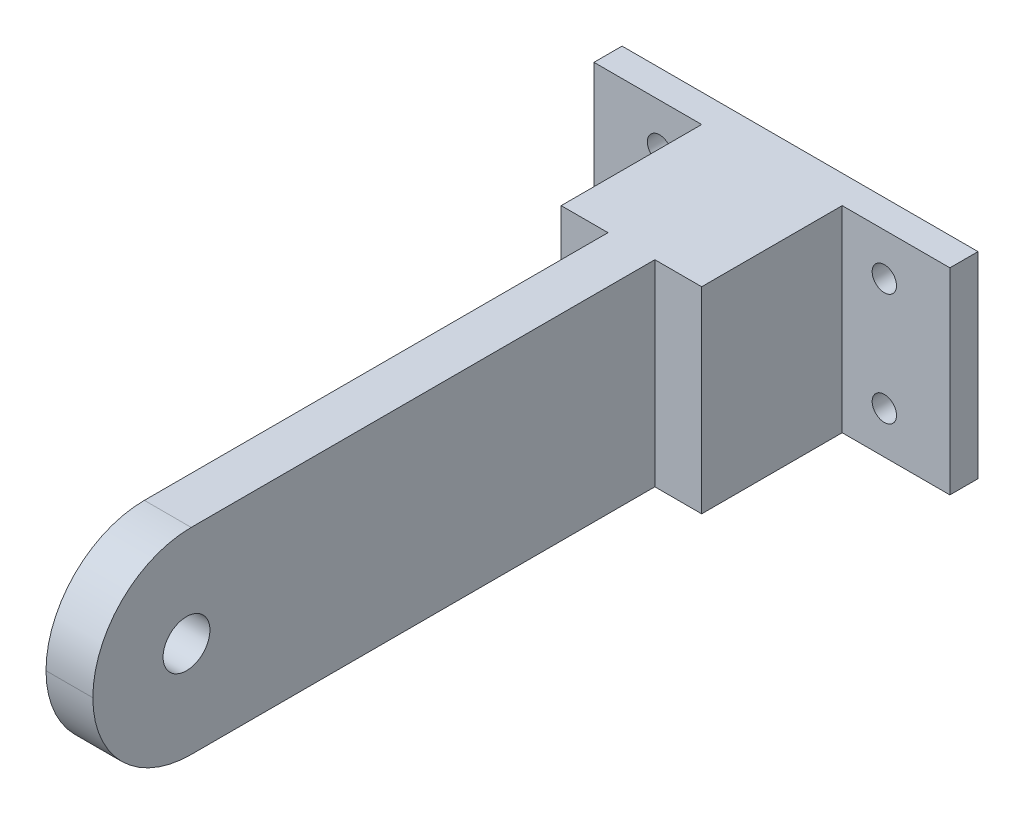
ISO-10303-21;
HEADER;
FILE_DESCRIPTION(('STEP AP214'),'2;1');
FILE_NAME('part.step','',(''),(''),'','','');
FILE_SCHEMA(('AUTOMOTIVE_DESIGN { 1 0 10303 214 1 1 1 1 }'));
ENDSEC;
DATA;
#1=APPLICATION_CONTEXT('core data for automotive mechanical design processes');
#2=APPLICATION_PROTOCOL_DEFINITION('international standard','automotive_design',2000,#1);
#3=PRODUCT_CONTEXT('',#1,'mechanical');
#4=PRODUCT('Part','Part','',(#3));
#5=PRODUCT_RELATED_PRODUCT_CATEGORY('part','',(#4));
#6=PRODUCT_DEFINITION_FORMATION('','',#4);
#7=PRODUCT_DEFINITION_CONTEXT('part definition',#1,'design');
#8=PRODUCT_DEFINITION('design','',#6,#7);
#9=PRODUCT_DEFINITION_SHAPE('','',#8);
#10=(LENGTH_UNIT() NAMED_UNIT(*) SI_UNIT(.MILLI.,.METRE.));
#11=(NAMED_UNIT(*) PLANE_ANGLE_UNIT() SI_UNIT($,.RADIAN.));
#12=(NAMED_UNIT(*) SI_UNIT($,.STERADIAN.) SOLID_ANGLE_UNIT());
#13=UNCERTAINTY_MEASURE_WITH_UNIT(LENGTH_MEASURE(1.E-05),#10,'distance_accuracy_value','');
#14=(GEOMETRIC_REPRESENTATION_CONTEXT(3) GLOBAL_UNCERTAINTY_ASSIGNED_CONTEXT((#13)) GLOBAL_UNIT_ASSIGNED_CONTEXT((#10,
#11,#12)) REPRESENTATION_CONTEXT('',''));
#15=CARTESIAN_POINT('',(0.,0.,0.));
#16=DIRECTION('',(0.,0.,1.));
#17=DIRECTION('',(1.,0.,0.));
#18=AXIS2_PLACEMENT_3D('',#15,#16,#17);
#19=CARTESIAN_POINT('',(0.,0.,18.));
#20=DIRECTION('',(0.,0.,1.));
#21=DIRECTION('',(1.,0.,0.));
#22=AXIS2_PLACEMENT_3D('',#19,#20,#21);
#23=PLANE('',#22);
#24=DIRECTION('',(0.,-1.,0.));
#25=VECTOR('',#24,1.);
#26=CARTESIAN_POINT('',(-11.2897435897436,8.09487179487179,18.));
#27=LINE('',#26,#25);
#28=CARTESIAN_POINT('',(-11.2897435897436,8.09487179487179,18.));
#29=VERTEX_POINT('',#28);
#30=CARTESIAN_POINT('',(-11.2897435897436,-12.9051282051282,18.));
#31=VERTEX_POINT('',#30);
#32=EDGE_CURVE('E157',#29,#31,#27,.T.);
#33=ORIENTED_EDGE('',*,*,#32,.F.);
#34=DIRECTION('',(-1.,0.,0.));
#35=VECTOR('',#34,1.);
#36=CARTESIAN_POINT('',(-16.2897435897436,8.09487179487179,18.));
#37=LINE('',#36,#35);
#38=CARTESIAN_POINT('',(-16.2897435897436,8.09487179487179,18.));
#39=VERTEX_POINT('',#38);
#40=EDGE_CURVE('E154',#29,#39,#37,.T.);
#41=ORIENTED_EDGE('',*,*,#40,.T.);
#42=DIRECTION('',(0.,-1.,0.));
#43=VECTOR('',#42,1.);
#44=CARTESIAN_POINT('',(-16.2897435897436,8.09487179487179,18.));
#45=LINE('',#44,#43);
#46=CARTESIAN_POINT('',(-16.2897435897436,-12.9051282051282,18.));
#47=VERTEX_POINT('',#46);
#48=EDGE_CURVE('E169',#39,#47,#45,.T.);
#49=ORIENTED_EDGE('',*,*,#48,.T.);
#50=DIRECTION('',(1.,0.,0.));
#51=VECTOR('',#50,1.);
#52=CARTESIAN_POINT('',(-16.2897435897436,-12.9051282051282,18.));
#53=LINE('',#52,#51);
#54=EDGE_CURVE('E174',#47,#31,#53,.T.);
#55=ORIENTED_EDGE('',*,*,#54,.T.);
#56=EDGE_LOOP('',(#33,#41,#49,#55));
#57=FACE_BOUND('',#56,.T.);
#58=ADVANCED_FACE('F41',(#57),#23,.T.);
#59=CARTESIAN_POINT('',(0.,0.,3.));
#60=DIRECTION('',(0.,0.,1.));
#61=DIRECTION('',(1.,0.,0.));
#62=AXIS2_PLACEMENT_3D('',#59,#60,#61);
#63=PLANE('',#62);
#64=DIRECTION('',(0.,-1.,0.));
#65=VECTOR('',#64,1.);
#66=CARTESIAN_POINT('',(-16.2897435897436,8.09487179487179,3.));
#67=LINE('',#66,#65);
#68=CARTESIAN_POINT('',(-16.2897435897436,8.09487179487179,3.));
#69=VERTEX_POINT('',#68);
#70=CARTESIAN_POINT('',(-16.2897435897436,-12.9051282051282,3.));
#71=VERTEX_POINT('',#70);
#72=EDGE_CURVE('E168',#69,#71,#67,.T.);
#73=ORIENTED_EDGE('',*,*,#72,.F.);
#74=DIRECTION('',(-1.,0.,0.));
#75=VECTOR('',#74,1.);
#76=CARTESIAN_POINT('',(-27.7897435897436,8.09487179487179,3.));
#77=LINE('',#76,#75);
#78=CARTESIAN_POINT('',(-27.7897435897436,8.09487179487179,3.));
#79=VERTEX_POINT('',#78);
#80=EDGE_CURVE('E226',#69,#79,#77,.T.);
#81=ORIENTED_EDGE('',*,*,#80,.T.);
#82=DIRECTION('',(0.,-1.,0.));
#83=VECTOR('',#82,1.);
#84=CARTESIAN_POINT('',(-27.7897435897436,8.09487179487179,3.));
#85=LINE('',#84,#83);
#86=CARTESIAN_POINT('',(-27.7897435897436,-12.9051282051282,3.));
#87=VERTEX_POINT('',#86);
#88=EDGE_CURVE('E217',#79,#87,#85,.T.);
#89=ORIENTED_EDGE('',*,*,#88,.T.);
#90=DIRECTION('',(1.,0.,0.));
#91=VECTOR('',#90,1.);
#92=CARTESIAN_POINT('',(-27.7897435897436,-12.9051282051282,3.));
#93=LINE('',#92,#91);
#94=EDGE_CURVE('E222',#87,#71,#93,.T.);
#95=ORIENTED_EDGE('',*,*,#94,.T.);
#96=EDGE_LOOP('',(#73,#81,#89,#95));
#97=FACE_BOUND('',#96,.T.);
#98=CARTESIAN_POINT('',(-20.7897435897436,-8.40512820512821,3.));
#99=DIRECTION('',(0.,0.,1.));
#100=DIRECTION('',(1.,0.,0.));
#101=AXIS2_PLACEMENT_3D('',#98,#99,#100);
#102=CIRCLE('',#101,1.3);
#103=CARTESIAN_POINT('',(-19.4897435897436,-8.40512820512821,3.));
#104=VERTEX_POINT('',#103);
#105=EDGE_CURVE('E212',#104,#104,#102,.T.);
#106=ORIENTED_EDGE('',*,*,#105,.F.);
#107=EDGE_LOOP('',(#106));
#108=FACE_BOUND('',#107,.T.);
#109=CARTESIAN_POINT('',(-20.7897435897436,3.59487179487179,3.));
#110=DIRECTION('',(0.,0.,1.));
#111=DIRECTION('',(1.,0.,0.));
#112=AXIS2_PLACEMENT_3D('',#109,#110,#111);
#113=CIRCLE('',#112,1.3);
#114=CARTESIAN_POINT('',(-19.4897435897436,3.59487179487179,3.));
#115=VERTEX_POINT('',#114);
#116=EDGE_CURVE('E209',#115,#115,#113,.T.);
#117=ORIENTED_EDGE('',*,*,#116,.F.);
#118=EDGE_LOOP('',(#117));
#119=FACE_BOUND('',#118,.T.);
#120=ADVANCED_FACE('F288',(#97,#108,#119),#63,.T.);
#121=CARTESIAN_POINT('',(-27.7897435897436,8.09487179487179,3.));
#122=DIRECTION('',(1.,0.,0.));
#123=DIRECTION('',(0.,1.,0.));
#124=AXIS2_PLACEMENT_3D('',#121,#122,#123);
#125=PLANE('',#124);
#126=DIRECTION('',(0.,-1.,0.));
#127=VECTOR('',#126,1.);
#128=CARTESIAN_POINT('',(-27.7897435897436,8.09487179487179,0.));
#129=LINE('',#128,#127);
#130=CARTESIAN_POINT('',(-27.7897435897436,8.09487179487179,0.));
#131=VERTEX_POINT('',#130);
#132=CARTESIAN_POINT('',(-27.7897435897436,-12.9051282051282,0.));
#133=VERTEX_POINT('',#132);
#134=EDGE_CURVE('E208',#131,#133,#129,.T.);
#135=ORIENTED_EDGE('',*,*,#134,.T.);
#136=DIRECTION('',(0.,0.,-1.));
#137=VECTOR('',#136,1.);
#138=CARTESIAN_POINT('',(-27.7897435897436,-12.9051282051282,3.));
#139=LINE('',#138,#137);
#140=EDGE_CURVE('E245',#87,#133,#139,.T.);
#141=ORIENTED_EDGE('',*,*,#140,.F.);
#142=ORIENTED_EDGE('',*,*,#88,.F.);
#143=DIRECTION('',(0.,0.,-1.));
#144=VECTOR('',#143,1.);
#145=CARTESIAN_POINT('',(-27.7897435897436,8.09487179487179,3.));
#146=LINE('',#145,#144);
#147=EDGE_CURVE('E229',#79,#131,#146,.T.);
#148=ORIENTED_EDGE('',*,*,#147,.T.);
#149=EDGE_LOOP('',(#135,#141,#142,#148));
#150=FACE_BOUND('',#149,.T.);
#151=ADVANCED_FACE('F295',(#150),#125,.F.);
#152=CARTESIAN_POINT('',(-27.7897435897436,-12.9051282051282,3.));
#153=DIRECTION('',(0.,1.,0.));
#154=DIRECTION('',(0.,0.,1.));
#155=AXIS2_PLACEMENT_3D('',#152,#153,#154);
#156=PLANE('',#155);
#157=DIRECTION('',(0.,0.,-1.));
#158=VECTOR('',#157,1.);
#159=CARTESIAN_POINT('',(-6.28974358974358,-12.9051282051282,78.));
#160=LINE('',#159,#158);
#161=CARTESIAN_POINT('',(-6.28974358974358,-12.9051282051282,67.5));
#162=VERTEX_POINT('',#161);
#163=CARTESIAN_POINT('',(-6.28974358974358,-12.9051282051282,18.));
#164=VERTEX_POINT('',#163);
#165=EDGE_CURVE('E142',#162,#164,#160,.T.);
#166=ORIENTED_EDGE('',*,*,#165,.F.);
#167=DIRECTION('',(1.,0.,0.));
#168=VECTOR('',#167,1.);
#169=CARTESIAN_POINT('',(-11.2897435897436,-12.9051282051282,67.5));
#170=LINE('',#169,#168);
#171=CARTESIAN_POINT('',(-11.2897435897436,-12.9051282051282,67.5));
#172=VERTEX_POINT('',#171);
#173=EDGE_CURVE('E11',#162,#172,#170,.F.);
#174=ORIENTED_EDGE('',*,*,#173,.T.);
#175=DIRECTION('',(0.,0.,-1.));
#176=VECTOR('',#175,1.);
#177=CARTESIAN_POINT('',(-11.2897435897436,-12.9051282051282,78.));
#178=LINE('',#177,#176);
#179=EDGE_CURVE('E166',#172,#31,#178,.T.);
#180=ORIENTED_EDGE('',*,*,#179,.T.);
#181=ORIENTED_EDGE('',*,*,#54,.F.);
#182=DIRECTION('',(0.,0.,-1.));
#183=VECTOR('',#182,1.);
#184=CARTESIAN_POINT('',(-16.2897435897436,-12.9051282051282,18.));
#185=LINE('',#184,#183);
#186=EDGE_CURVE('E189',#47,#71,#185,.T.);
#187=ORIENTED_EDGE('',*,*,#186,.T.);
#188=ORIENTED_EDGE('',*,*,#94,.F.);
#189=ORIENTED_EDGE('',*,*,#140,.T.);
#190=DIRECTION('',(1.,0.,0.));
#191=VECTOR('',#190,1.);
#192=CARTESIAN_POINT('',(-27.7897435897436,-12.9051282051282,0.));
#193=LINE('',#192,#191);
#194=CARTESIAN_POINT('',(10.2102564102564,-12.9051282051282,0.));
#195=VERTEX_POINT('',#194);
#196=EDGE_CURVE('E232',#133,#195,#193,.T.);
#197=ORIENTED_EDGE('',*,*,#196,.T.);
#198=DIRECTION('',(0.,0.,-1.));
#199=VECTOR('',#198,1.);
#200=CARTESIAN_POINT('',(10.2102564102564,-12.9051282051282,3.));
#201=LINE('',#200,#199);
#202=CARTESIAN_POINT('',(10.2102564102564,-12.9051282051282,3.));
#203=VERTEX_POINT('',#202);
#204=EDGE_CURVE('E242',#203,#195,#201,.T.);
#205=ORIENTED_EDGE('',*,*,#204,.F.);
#206=CARTESIAN_POINT('',(-1.28974358974358,-12.9051282051282,3.));
#207=VERTEX_POINT('',#206);
#208=EDGE_CURVE('E220',#207,#203,#93,.T.);
#209=ORIENTED_EDGE('',*,*,#208,.F.);
#210=DIRECTION('',(0.,0.,-1.));
#211=VECTOR('',#210,1.);
#212=CARTESIAN_POINT('',(-1.28974358974358,-12.9051282051282,18.));
#213=LINE('',#212,#211);
#214=CARTESIAN_POINT('',(-1.28974358974358,-12.9051282051282,18.));
#215=VERTEX_POINT('',#214);
#216=EDGE_CURVE('E186',#215,#207,#213,.T.);
#217=ORIENTED_EDGE('',*,*,#216,.F.);
#218=EDGE_CURVE('E172',#164,#215,#53,.T.);
#219=ORIENTED_EDGE('',*,*,#218,.F.);
#220=EDGE_LOOP('',(#166,#174,#180,#181,#187,#188,#189,#197,#205,#209,#217,#219));
#221=FACE_BOUND('',#220,.T.);
#222=ADVANCED_FACE('F340',(#221),#156,.F.);
#223=CARTESIAN_POINT('',(10.2102564102564,8.09487179487179,3.));
#224=DIRECTION('',(-1.,0.,0.));
#225=DIRECTION('',(0.,-1.,0.));
#226=AXIS2_PLACEMENT_3D('',#223,#224,#225);
#227=PLANE('',#226);
#228=DIRECTION('',(0.,1.,0.));
#229=VECTOR('',#228,1.);
#230=CARTESIAN_POINT('',(10.2102564102564,8.09487179487179,0.));
#231=LINE('',#230,#229);
#232=CARTESIAN_POINT('',(10.2102564102564,8.09487179487179,0.));
#233=VERTEX_POINT('',#232);
#234=EDGE_CURVE('E234',#195,#233,#231,.T.);
#235=ORIENTED_EDGE('',*,*,#234,.T.);
#236=DIRECTION('',(0.,0.,-1.));
#237=VECTOR('',#236,1.);
#238=CARTESIAN_POINT('',(10.2102564102564,8.09487179487179,3.));
#239=LINE('',#238,#237);
#240=CARTESIAN_POINT('',(10.2102564102564,8.09487179487179,3.));
#241=VERTEX_POINT('',#240);
#242=EDGE_CURVE('E239',#241,#233,#239,.T.);
#243=ORIENTED_EDGE('',*,*,#242,.F.);
#244=DIRECTION('',(0.,1.,0.));
#245=VECTOR('',#244,1.);
#246=CARTESIAN_POINT('',(10.2102564102564,8.09487179487179,3.));
#247=LINE('',#246,#245);
#248=EDGE_CURVE('E224',#203,#241,#247,.T.);
#249=ORIENTED_EDGE('',*,*,#248,.F.);
#250=ORIENTED_EDGE('',*,*,#204,.T.);
#251=EDGE_LOOP('',(#235,#243,#249,#250));
#252=FACE_BOUND('',#251,.T.);
#253=ADVANCED_FACE('F337',(#252),#227,.F.);
#254=CARTESIAN_POINT('',(-27.7897435897436,8.09487179487179,3.));
#255=DIRECTION('',(0.,-1.,0.));
#256=DIRECTION('',(0.,0.,-1.));
#257=AXIS2_PLACEMENT_3D('',#254,#255,#256);
#258=PLANE('',#257);
#259=DIRECTION('',(0.,0.,-1.));
#260=VECTOR('',#259,1.);
#261=CARTESIAN_POINT('',(-11.2897435897436,8.09487179487179,78.));
#262=LINE('',#261,#260);
#263=CARTESIAN_POINT('',(-11.2897435897436,8.09487179487179,67.5));
#264=VERTEX_POINT('',#263);
#265=EDGE_CURVE('E143',#264,#29,#262,.T.);
#266=ORIENTED_EDGE('',*,*,#265,.F.);
#267=DIRECTION('',(-1.,0.,0.));
#268=VECTOR('',#267,1.);
#269=CARTESIAN_POINT('',(-6.28974358974358,8.09487179487179,67.5));
#270=LINE('',#269,#268);
#271=CARTESIAN_POINT('',(-6.28974358974358,8.09487179487179,67.5));
#272=VERTEX_POINT('',#271);
#273=EDGE_CURVE('E140',#264,#272,#270,.F.);
#274=ORIENTED_EDGE('',*,*,#273,.T.);
#275=DIRECTION('',(0.,0.,-1.));
#276=VECTOR('',#275,1.);
#277=CARTESIAN_POINT('',(-6.28974358974358,8.09487179487179,78.));
#278=LINE('',#277,#276);
#279=CARTESIAN_POINT('',(-6.28974358974358,8.09487179487179,18.));
#280=VERTEX_POINT('',#279);
#281=EDGE_CURVE('E133',#272,#280,#278,.T.);
#282=ORIENTED_EDGE('',*,*,#281,.T.);
#283=CARTESIAN_POINT('',(-1.28974358974358,8.09487179487179,18.));
#284=VERTEX_POINT('',#283);
#285=EDGE_CURVE('E138',#284,#280,#37,.T.);
#286=ORIENTED_EDGE('',*,*,#285,.F.);
#287=DIRECTION('',(0.,0.,-1.));
#288=VECTOR('',#287,1.);
#289=CARTESIAN_POINT('',(-1.28974358974358,8.09487179487179,18.));
#290=LINE('',#289,#288);
#291=CARTESIAN_POINT('',(-1.28974358974358,8.09487179487179,3.));
#292=VERTEX_POINT('',#291);
#293=EDGE_CURVE('E184',#284,#292,#290,.T.);
#294=ORIENTED_EDGE('',*,*,#293,.T.);
#295=EDGE_CURVE('E227',#241,#292,#77,.T.);
#296=ORIENTED_EDGE('',*,*,#295,.F.);
#297=ORIENTED_EDGE('',*,*,#242,.T.);
#298=DIRECTION('',(-1.,0.,0.));
#299=VECTOR('',#298,1.);
#300=CARTESIAN_POINT('',(-27.7897435897436,8.09487179487179,0.));
#301=LINE('',#300,#299);
#302=EDGE_CURVE('E221',#233,#131,#301,.T.);
#303=ORIENTED_EDGE('',*,*,#302,.T.);
#304=ORIENTED_EDGE('',*,*,#147,.F.);
#305=ORIENTED_EDGE('',*,*,#80,.F.);
#306=DIRECTION('',(0.,0.,-1.));
#307=VECTOR('',#306,1.);
#308=CARTESIAN_POINT('',(-16.2897435897436,8.09487179487179,18.));
#309=LINE('',#308,#307);
#310=EDGE_CURVE('E153',#39,#69,#309,.T.);
#311=ORIENTED_EDGE('',*,*,#310,.F.);
#312=ORIENTED_EDGE('',*,*,#40,.F.);
#313=EDGE_LOOP('',(#266,#274,#282,#286,#294,#296,#297,#303,#304,#305,#311,#312));
#314=FACE_BOUND('',#313,.T.);
#315=ADVANCED_FACE('F136',(#314),#258,.F.);
#316=DIRECTION('',(0.,1.,0.));
#317=VECTOR('',#316,1.);
#318=CARTESIAN_POINT('',(-1.28974358974358,8.09487179487179,3.));
#319=LINE('',#318,#317);
#320=EDGE_CURVE('E173',#207,#292,#319,.T.);
#321=ORIENTED_EDGE('',*,*,#320,.F.);
#322=ORIENTED_EDGE('',*,*,#208,.T.);
#323=ORIENTED_EDGE('',*,*,#248,.T.);
#324=ORIENTED_EDGE('',*,*,#295,.T.);
#325=EDGE_LOOP('',(#321,#322,#323,#324));
#326=FACE_BOUND('',#325,.T.);
#327=CARTESIAN_POINT('',(3.21025641025642,3.59487179487179,3.));
#328=DIRECTION('',(0.,0.,1.));
#329=DIRECTION('',(1.,0.,0.));
#330=AXIS2_PLACEMENT_3D('',#327,#328,#329);
#331=CIRCLE('',#330,1.3);
#332=CARTESIAN_POINT('',(4.51025641025642,3.59487179487179,3.));
#333=VERTEX_POINT('',#332);
#334=EDGE_CURVE('E197',#333,#333,#331,.T.);
#335=ORIENTED_EDGE('',*,*,#334,.F.);
#336=EDGE_LOOP('',(#335));
#337=FACE_BOUND('',#336,.T.);
#338=CARTESIAN_POINT('',(3.21025641025642,-8.40512820512821,3.));
#339=DIRECTION('',(0.,0.,1.));
#340=DIRECTION('',(1.,0.,0.));
#341=AXIS2_PLACEMENT_3D('',#338,#339,#340);
#342=CIRCLE('',#341,1.3);
#343=CARTESIAN_POINT('',(4.51025641025641,-8.40512820512821,3.));
#344=VERTEX_POINT('',#343);
#345=EDGE_CURVE('E192',#344,#344,#342,.T.);
#346=ORIENTED_EDGE('',*,*,#345,.F.);
#347=EDGE_LOOP('',(#346));
#348=FACE_BOUND('',#347,.T.);
#349=ADVANCED_FACE('F298',(#326,#337,#348),#63,.T.);
#350=CARTESIAN_POINT('',(0.,0.,0.));
#351=DIRECTION('',(0.,0.,1.));
#352=DIRECTION('',(1.,0.,0.));
#353=AXIS2_PLACEMENT_3D('',#350,#351,#352);
#354=PLANE('',#353);
#355=CARTESIAN_POINT('',(3.21025641025642,3.59487179487179,0.));
#356=DIRECTION('',(0.,0.,1.));
#357=DIRECTION('',(1.,0.,0.));
#358=AXIS2_PLACEMENT_3D('',#355,#356,#357);
#359=CIRCLE('',#358,1.3);
#360=CARTESIAN_POINT('',(4.51025641025642,3.59487179487179,0.));
#361=VERTEX_POINT('',#360);
#362=EDGE_CURVE('E193',#361,#361,#359,.T.);
#363=ORIENTED_EDGE('',*,*,#362,.T.);
#364=EDGE_LOOP('',(#363));
#365=FACE_BOUND('',#364,.T.);
#366=CARTESIAN_POINT('',(3.21025641025642,-8.40512820512821,0.));
#367=DIRECTION('',(0.,0.,1.));
#368=DIRECTION('',(1.,0.,0.));
#369=AXIS2_PLACEMENT_3D('',#366,#367,#368);
#370=CIRCLE('',#369,1.3);
#371=CARTESIAN_POINT('',(4.51025641025641,-8.40512820512821,0.));
#372=VERTEX_POINT('',#371);
#373=EDGE_CURVE('E200',#372,#372,#370,.T.);
#374=ORIENTED_EDGE('',*,*,#373,.T.);
#375=EDGE_LOOP('',(#374));
#376=FACE_BOUND('',#375,.T.);
#377=CARTESIAN_POINT('',(-20.7897435897436,3.59487179487179,0.));
#378=DIRECTION('',(0.,0.,1.));
#379=DIRECTION('',(1.,0.,0.));
#380=AXIS2_PLACEMENT_3D('',#377,#378,#379);
#381=CIRCLE('',#380,1.3);
#382=CARTESIAN_POINT('',(-19.4897435897436,3.59487179487179,0.));
#383=VERTEX_POINT('',#382);
#384=EDGE_CURVE('E205',#383,#383,#381,.T.);
#385=ORIENTED_EDGE('',*,*,#384,.T.);
#386=EDGE_LOOP('',(#385));
#387=FACE_BOUND('',#386,.T.);
#388=CARTESIAN_POINT('',(-20.7897435897436,-8.40512820512821,0.));
#389=DIRECTION('',(0.,0.,1.));
#390=DIRECTION('',(1.,0.,0.));
#391=AXIS2_PLACEMENT_3D('',#388,#389,#390);
#392=CIRCLE('',#391,1.3);
#393=CARTESIAN_POINT('',(-19.4897435897436,-8.40512820512821,0.));
#394=VERTEX_POINT('',#393);
#395=EDGE_CURVE('E196',#394,#394,#392,.T.);
#396=ORIENTED_EDGE('',*,*,#395,.T.);
#397=EDGE_LOOP('',(#396));
#398=FACE_BOUND('',#397,.T.);
#399=ORIENTED_EDGE('',*,*,#134,.F.);
#400=ORIENTED_EDGE('',*,*,#302,.F.);
#401=ORIENTED_EDGE('',*,*,#234,.F.);
#402=ORIENTED_EDGE('',*,*,#196,.F.);
#403=EDGE_LOOP('',(#399,#400,#401,#402));
#404=FACE_BOUND('',#403,.T.);
#405=ADVANCED_FACE('F327',(#365,#376,#387,#398,#404),#354,.F.);
#406=CARTESIAN_POINT('',(-20.7897435897436,-8.40512820512821,0.));
#407=DIRECTION('',(0.,0.,1.));
#408=DIRECTION('',(1.,0.,0.));
#409=AXIS2_PLACEMENT_3D('',#406,#407,#408);
#410=CYLINDRICAL_SURFACE('',#409,1.3);
#411=ORIENTED_EDGE('',*,*,#395,.F.);
#412=EDGE_LOOP('',(#411));
#413=FACE_BOUND('',#412,.T.);
#414=ORIENTED_EDGE('',*,*,#105,.T.);
#415=EDGE_LOOP('',(#414));
#416=FACE_BOUND('',#415,.T.);
#417=ADVANCED_FACE('F324',(#413,#416),#410,.F.);
#418=CARTESIAN_POINT('',(-20.7897435897436,3.59487179487179,0.));
#419=DIRECTION('',(0.,0.,1.));
#420=DIRECTION('',(1.,0.,0.));
#421=AXIS2_PLACEMENT_3D('',#418,#419,#420);
#422=CYLINDRICAL_SURFACE('',#421,1.3);
#423=ORIENTED_EDGE('',*,*,#384,.F.);
#424=EDGE_LOOP('',(#423));
#425=FACE_BOUND('',#424,.T.);
#426=ORIENTED_EDGE('',*,*,#116,.T.);
#427=EDGE_LOOP('',(#426));
#428=FACE_BOUND('',#427,.T.);
#429=ADVANCED_FACE('F320',(#425,#428),#422,.F.);
#430=CARTESIAN_POINT('',(3.21025641025642,-8.40512820512821,0.));
#431=DIRECTION('',(0.,0.,1.));
#432=DIRECTION('',(1.,0.,0.));
#433=AXIS2_PLACEMENT_3D('',#430,#431,#432);
#434=CYLINDRICAL_SURFACE('',#433,1.3);
#435=ORIENTED_EDGE('',*,*,#373,.F.);
#436=EDGE_LOOP('',(#435));
#437=FACE_BOUND('',#436,.T.);
#438=ORIENTED_EDGE('',*,*,#345,.T.);
#439=EDGE_LOOP('',(#438));
#440=FACE_BOUND('',#439,.T.);
#441=ADVANCED_FACE('F316',(#437,#440),#434,.F.);
#442=CARTESIAN_POINT('',(3.21025641025642,3.59487179487179,0.));
#443=DIRECTION('',(0.,0.,1.));
#444=DIRECTION('',(1.,0.,0.));
#445=AXIS2_PLACEMENT_3D('',#442,#443,#444);
#446=CYLINDRICAL_SURFACE('',#445,1.3);
#447=ORIENTED_EDGE('',*,*,#362,.F.);
#448=EDGE_LOOP('',(#447));
#449=FACE_BOUND('',#448,.T.);
#450=ORIENTED_EDGE('',*,*,#334,.T.);
#451=EDGE_LOOP('',(#450));
#452=FACE_BOUND('',#451,.T.);
#453=ADVANCED_FACE('F310',(#449,#452),#446,.F.);
#454=CARTESIAN_POINT('',(-16.2897435897436,8.09487179487179,18.));
#455=DIRECTION('',(1.,0.,0.));
#456=DIRECTION('',(0.,1.,0.));
#457=AXIS2_PLACEMENT_3D('',#454,#455,#456);
#458=PLANE('',#457);
#459=ORIENTED_EDGE('',*,*,#72,.T.);
#460=ORIENTED_EDGE('',*,*,#186,.F.);
#461=ORIENTED_EDGE('',*,*,#48,.F.);
#462=ORIENTED_EDGE('',*,*,#310,.T.);
#463=EDGE_LOOP('',(#459,#460,#461,#462));
#464=FACE_BOUND('',#463,.T.);
#465=ADVANCED_FACE('F305',(#464),#458,.F.);
#466=CARTESIAN_POINT('',(-1.28974358974358,8.09487179487179,18.));
#467=DIRECTION('',(-1.,0.,0.));
#468=DIRECTION('',(0.,-1.,0.));
#469=AXIS2_PLACEMENT_3D('',#466,#467,#468);
#470=PLANE('',#469);
#471=ORIENTED_EDGE('',*,*,#320,.T.);
#472=ORIENTED_EDGE('',*,*,#293,.F.);
#473=DIRECTION('',(0.,1.,0.));
#474=VECTOR('',#473,1.);
#475=CARTESIAN_POINT('',(-1.28974358974358,8.09487179487179,18.));
#476=LINE('',#475,#474);
#477=EDGE_CURVE('E151',#215,#284,#476,.T.);
#478=ORIENTED_EDGE('',*,*,#477,.F.);
#479=ORIENTED_EDGE('',*,*,#216,.T.);
#480=EDGE_LOOP('',(#471,#472,#478,#479));
#481=FACE_BOUND('',#480,.T.);
#482=ADVANCED_FACE('F301',(#481),#470,.F.);
#483=DIRECTION('',(0.,1.,0.));
#484=VECTOR('',#483,1.);
#485=CARTESIAN_POINT('',(-6.28974358974358,8.09487179487179,18.));
#486=LINE('',#485,#484);
#487=EDGE_CURVE('E148',#164,#280,#486,.T.);
#488=ORIENTED_EDGE('',*,*,#487,.F.);
#489=ORIENTED_EDGE('',*,*,#218,.T.);
#490=ORIENTED_EDGE('',*,*,#477,.T.);
#491=ORIENTED_EDGE('',*,*,#285,.T.);
#492=EDGE_LOOP('',(#488,#489,#490,#491));
#493=FACE_BOUND('',#492,.T.);
#494=ADVANCED_FACE('F147',(#493),#23,.T.);
#495=CARTESIAN_POINT('',(-11.2897435897436,8.09487179487179,78.));
#496=DIRECTION('',(1.,0.,0.));
#497=DIRECTION('',(0.,1.,0.));
#498=AXIS2_PLACEMENT_3D('',#495,#496,#497);
#499=PLANE('',#498);
#500=CARTESIAN_POINT('',(-11.2897435897436,-2.40512820512821,68.));
#501=DIRECTION('',(1.,0.,0.));
#502=DIRECTION('',(0.,1.,0.));
#503=AXIS2_PLACEMENT_3D('',#500,#501,#502);
#504=CIRCLE('',#503,2.5);
#505=CARTESIAN_POINT('',(-11.2897435897436,0.0948717948717876,68.));
#506=VERTEX_POINT('',#505);
#507=EDGE_CURVE('E161',#506,#506,#504,.T.);
#508=ORIENTED_EDGE('',*,*,#507,.T.);
#509=EDGE_LOOP('',(#508));
#510=FACE_BOUND('',#509,.T.);
#511=CARTESIAN_POINT('',(-11.2897435897436,-2.40512820512821,67.5));
#512=DIRECTION('',(1.,0.,0.));
#513=DIRECTION('',(0.,1.,0.));
#514=AXIS2_PLACEMENT_3D('',#511,#512,#513);
#515=CIRCLE('',#514,10.5);
#516=CARTESIAN_POINT('',(-11.2897435897436,-2.4051282051282,78.));
#517=VERTEX_POINT('',#516);
#518=EDGE_CURVE('E248',#172,#517,#515,.F.);
#519=ORIENTED_EDGE('',*,*,#518,.T.);
#520=CARTESIAN_POINT('',(-11.2897435897436,-2.40512820512821,67.5));
#521=DIRECTION('',(1.,0.,0.));
#522=DIRECTION('',(0.,1.,0.));
#523=AXIS2_PLACEMENT_3D('',#520,#521,#522);
#524=CIRCLE('',#523,10.5);
#525=EDGE_CURVE('E250',#517,#264,#524,.F.);
#526=ORIENTED_EDGE('',*,*,#525,.T.);
#527=ORIENTED_EDGE('',*,*,#265,.T.);
#528=ORIENTED_EDGE('',*,*,#32,.T.);
#529=ORIENTED_EDGE('',*,*,#179,.F.);
#530=EDGE_LOOP('',(#519,#526,#527,#528,#529));
#531=FACE_BOUND('',#530,.T.);
#532=ADVANCED_FACE('F256',(#510,#531),#499,.F.);
#533=CARTESIAN_POINT('',(-6.28974358974358,8.09487179487179,78.));
#534=DIRECTION('',(-1.,0.,0.));
#535=DIRECTION('',(0.,-1.,0.));
#536=AXIS2_PLACEMENT_3D('',#533,#534,#535);
#537=PLANE('',#536);
#538=CARTESIAN_POINT('',(-6.28974358974358,-2.40512820512821,68.));
#539=DIRECTION('',(1.,0.,0.));
#540=DIRECTION('',(0.,1.,0.));
#541=AXIS2_PLACEMENT_3D('',#538,#539,#540);
#542=CIRCLE('',#541,2.5);
#543=CARTESIAN_POINT('',(-6.28974358974358,0.0948717948717876,68.));
#544=VERTEX_POINT('',#543);
#545=EDGE_CURVE('E267',#544,#544,#542,.T.);
#546=ORIENTED_EDGE('',*,*,#545,.F.);
#547=EDGE_LOOP('',(#546));
#548=FACE_BOUND('',#547,.T.);
#549=ORIENTED_EDGE('',*,*,#281,.F.);
#550=CARTESIAN_POINT('',(-6.28974358974358,-2.40512820512821,67.5));
#551=DIRECTION('',(-1.,0.,0.));
#552=DIRECTION('',(0.,-1.,0.));
#553=AXIS2_PLACEMENT_3D('',#550,#551,#552);
#554=CIRCLE('',#553,10.5);
#555=CARTESIAN_POINT('',(-6.28974358974358,-2.4051282051282,78.));
#556=VERTEX_POINT('',#555);
#557=EDGE_CURVE('E50',#272,#556,#554,.F.);
#558=ORIENTED_EDGE('',*,*,#557,.T.);
#559=CARTESIAN_POINT('',(-6.28974358974358,-2.40512820512821,67.5));
#560=DIRECTION('',(-1.,0.,0.));
#561=DIRECTION('',(0.,-1.,0.));
#562=AXIS2_PLACEMENT_3D('',#559,#560,#561);
#563=CIRCLE('',#562,10.5);
#564=EDGE_CURVE('E57',#556,#162,#563,.F.);
#565=ORIENTED_EDGE('',*,*,#564,.T.);
#566=ORIENTED_EDGE('',*,*,#165,.T.);
#567=ORIENTED_EDGE('',*,*,#487,.T.);
#568=EDGE_LOOP('',(#549,#558,#565,#566,#567));
#569=FACE_BOUND('',#568,.T.);
#570=ADVANCED_FACE('F156',(#548,#569),#537,.F.);
#571=CARTESIAN_POINT('',(-66.2897435897436,-2.40512820512821,68.));
#572=DIRECTION('',(1.,0.,0.));
#573=DIRECTION('',(0.,1.,0.));
#574=AXIS2_PLACEMENT_3D('',#571,#572,#573);
#575=CYLINDRICAL_SURFACE('',#574,2.5);
#576=ORIENTED_EDGE('',*,*,#545,.T.);
#577=EDGE_LOOP('',(#576));
#578=FACE_BOUND('',#577,.T.);
#579=ORIENTED_EDGE('',*,*,#507,.F.);
#580=EDGE_LOOP('',(#579));
#581=FACE_BOUND('',#580,.T.);
#582=ADVANCED_FACE('F276',(#578,#581),#575,.F.);
#583=CARTESIAN_POINT('',(0.,-2.40512820512821,67.5));
#584=DIRECTION('',(-1.,0.,0.));
#585=DIRECTION('',(0.,0.,1.));
#586=AXIS2_PLACEMENT_3D('',#583,#584,#585);
#587=CYLINDRICAL_SURFACE('',#586,10.5);
#588=ORIENTED_EDGE('',*,*,#173,.F.);
#589=ORIENTED_EDGE('',*,*,#564,.F.);
#590=DIRECTION('',(1.,0.,0.));
#591=VECTOR('',#590,1.);
#592=CARTESIAN_POINT('',(-6.28974358974358,-2.40512820512821,78.));
#593=LINE('',#592,#591);
#594=EDGE_CURVE('E45',#517,#556,#593,.T.);
#595=ORIENTED_EDGE('',*,*,#594,.F.);
#596=ORIENTED_EDGE('',*,*,#518,.F.);
#597=EDGE_LOOP('',(#588,#589,#595,#596));
#598=FACE_BOUND('',#597,.T.);
#599=ADVANCED_FACE('F43',(#598),#587,.T.);
#600=CARTESIAN_POINT('',(0.,-2.40512820512821,67.5));
#601=DIRECTION('',(1.,0.,0.));
#602=DIRECTION('',(0.,0.,-1.));
#603=AXIS2_PLACEMENT_3D('',#600,#601,#602);
#604=CYLINDRICAL_SURFACE('',#603,10.5);
#605=ORIENTED_EDGE('',*,*,#557,.F.);
#606=ORIENTED_EDGE('',*,*,#273,.F.);
#607=ORIENTED_EDGE('',*,*,#525,.F.);
#608=ORIENTED_EDGE('',*,*,#594,.T.);
#609=EDGE_LOOP('',(#605,#606,#607,#608));
#610=FACE_BOUND('',#609,.T.);
#611=ADVANCED_FACE('F265',(#610),#604,.T.);
#612=CLOSED_SHELL('',(#58,#120,#151,#222,#253,#315,#349,#405,#417,#429,#441,#453,#465,#482,#494,
#532,#570,#582,#599,#611));
#613=MANIFOLD_SOLID_BREP('B2',#612);
#614=ADVANCED_BREP_SHAPE_REPRESENTATION('',(#18,#613),#14);
#615=SHAPE_DEFINITION_REPRESENTATION(#9,#614);
ENDSEC;
END-ISO-10303-21;
